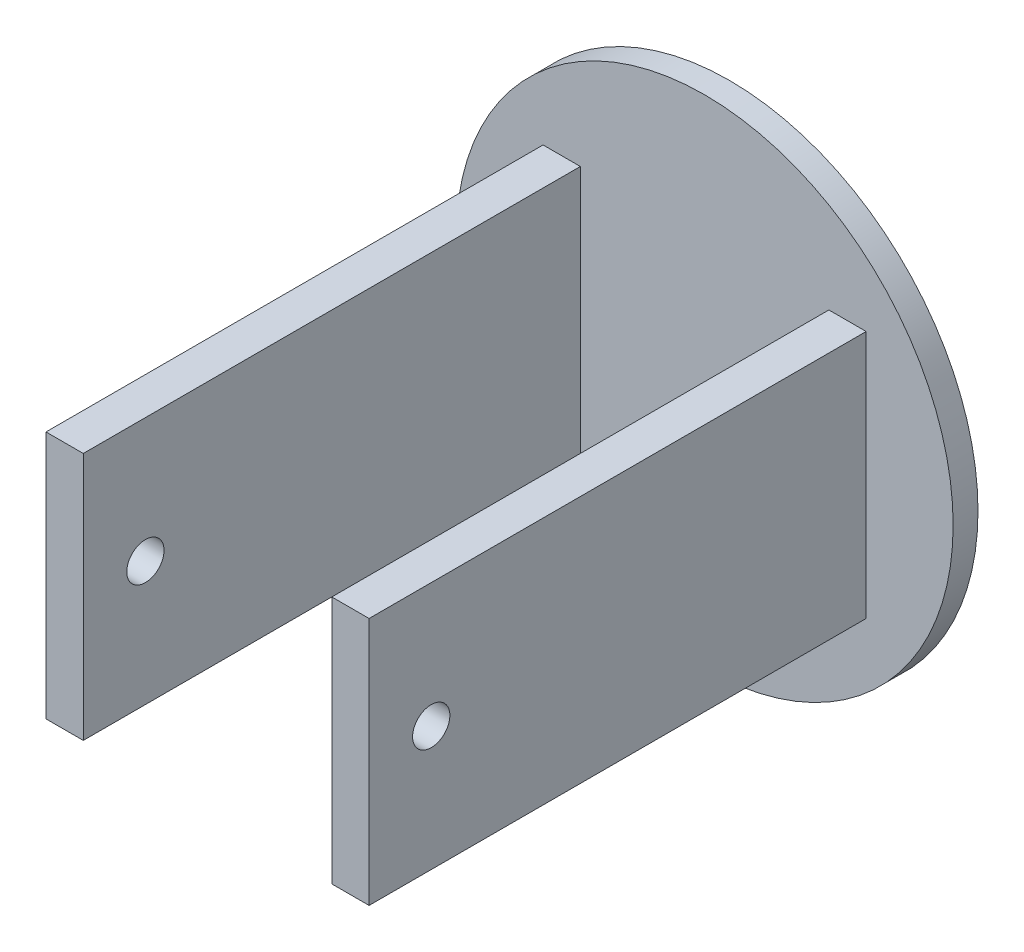
ISO-10303-21;
HEADER;
FILE_DESCRIPTION(('STEP AP214'),'2;1');
FILE_NAME('part.step','',(''),(''),'','','');
FILE_SCHEMA(('AUTOMOTIVE_DESIGN { 1 0 10303 214 1 1 1 1 }'));
ENDSEC;
DATA;
#1=APPLICATION_CONTEXT('core data for automotive mechanical design processes');
#2=APPLICATION_PROTOCOL_DEFINITION('international standard','automotive_design',2000,#1);
#3=PRODUCT_CONTEXT('',#1,'mechanical');
#4=PRODUCT('Part','Part','',(#3));
#5=PRODUCT_RELATED_PRODUCT_CATEGORY('part','',(#4));
#6=PRODUCT_DEFINITION_FORMATION('','',#4);
#7=PRODUCT_DEFINITION_CONTEXT('part definition',#1,'design');
#8=PRODUCT_DEFINITION('design','',#6,#7);
#9=PRODUCT_DEFINITION_SHAPE('','',#8);
#10=(LENGTH_UNIT() NAMED_UNIT(*) SI_UNIT(.MILLI.,.METRE.));
#11=(NAMED_UNIT(*) PLANE_ANGLE_UNIT() SI_UNIT($,.RADIAN.));
#12=(NAMED_UNIT(*) SI_UNIT($,.STERADIAN.) SOLID_ANGLE_UNIT());
#13=UNCERTAINTY_MEASURE_WITH_UNIT(LENGTH_MEASURE(1.E-05),#10,'distance_accuracy_value','');
#14=(GEOMETRIC_REPRESENTATION_CONTEXT(3) GLOBAL_UNCERTAINTY_ASSIGNED_CONTEXT((#13)) GLOBAL_UNIT_ASSIGNED_CONTEXT((#10,
#11,#12)) REPRESENTATION_CONTEXT('',''));
#15=CARTESIAN_POINT('',(0.,0.,0.));
#16=DIRECTION('',(0.,0.,1.));
#17=DIRECTION('',(1.,0.,0.));
#18=AXIS2_PLACEMENT_3D('',#15,#16,#17);
#19=CARTESIAN_POINT('',(0.,0.,2.));
#20=DIRECTION('',(0.,0.,1.));
#21=DIRECTION('',(1.,0.,0.));
#22=AXIS2_PLACEMENT_3D('',#19,#20,#21);
#23=PLANE('',#22);
#24=DIRECTION('',(0.,-1.,0.));
#25=VECTOR('',#24,1.);
#26=CARTESIAN_POINT('',(13.,10.,2.));
#27=LINE('',#26,#25);
#28=CARTESIAN_POINT('',(13.,10.,2.));
#29=VERTEX_POINT('',#28);
#30=CARTESIAN_POINT('',(13.,-10.,2.));
#31=VERTEX_POINT('',#30);
#32=EDGE_CURVE('E104',#29,#31,#27,.T.);
#33=ORIENTED_EDGE('',*,*,#32,.T.);
#34=DIRECTION('',(-1.,0.,0.));
#35=VECTOR('',#34,1.);
#36=CARTESIAN_POINT('',(13.,-10.,2.));
#37=LINE('',#36,#35);
#38=CARTESIAN_POINT('',(10.,-10.,2.));
#39=VERTEX_POINT('',#38);
#40=EDGE_CURVE('E118',#31,#39,#37,.T.);
#41=ORIENTED_EDGE('',*,*,#40,.T.);
#42=DIRECTION('',(0.,1.,0.));
#43=VECTOR('',#42,1.);
#44=CARTESIAN_POINT('',(10.,10.,2.));
#45=LINE('',#44,#43);
#46=CARTESIAN_POINT('',(10.,10.,2.));
#47=VERTEX_POINT('',#46);
#48=EDGE_CURVE('E54',#39,#47,#45,.T.);
#49=ORIENTED_EDGE('',*,*,#48,.T.);
#50=DIRECTION('',(1.,0.,0.));
#51=VECTOR('',#50,1.);
#52=CARTESIAN_POINT('',(13.,10.,2.));
#53=LINE('',#52,#51);
#54=EDGE_CURVE('E49',#47,#29,#53,.T.);
#55=ORIENTED_EDGE('',*,*,#54,.T.);
#56=EDGE_LOOP('',(#33,#41,#49,#55));
#57=FACE_BOUND('',#56,.T.);
#58=CARTESIAN_POINT('',(0.,0.,2.));
#59=DIRECTION('',(0.,0.,1.));
#60=DIRECTION('',(1.,0.,0.));
#61=AXIS2_PLACEMENT_3D('',#58,#59,#60);
#62=CIRCLE('',#61,20.);
#63=CARTESIAN_POINT('',(20.,0.,2.));
#64=VERTEX_POINT('',#63);
#65=EDGE_CURVE('E42',#64,#64,#62,.T.);
#66=ORIENTED_EDGE('',*,*,#65,.T.);
#67=EDGE_LOOP('',(#66));
#68=FACE_BOUND('',#67,.T.);
#69=DIRECTION('',(1.,0.,0.));
#70=VECTOR('',#69,1.);
#71=CARTESIAN_POINT('',(-13.,-10.,2.));
#72=LINE('',#71,#70);
#73=CARTESIAN_POINT('',(-13.,-10.,2.));
#74=VERTEX_POINT('',#73);
#75=CARTESIAN_POINT('',(-10.,-10.,2.));
#76=VERTEX_POINT('',#75);
#77=EDGE_CURVE('E151',#74,#76,#72,.T.);
#78=ORIENTED_EDGE('',*,*,#77,.F.);
#79=DIRECTION('',(0.,-1.,0.));
#80=VECTOR('',#79,1.);
#81=CARTESIAN_POINT('',(-13.,10.,2.));
#82=LINE('',#81,#80);
#83=CARTESIAN_POINT('',(-13.,10.,2.));
#84=VERTEX_POINT('',#83);
#85=EDGE_CURVE('E107',#84,#74,#82,.T.);
#86=ORIENTED_EDGE('',*,*,#85,.F.);
#87=DIRECTION('',(-1.,0.,0.));
#88=VECTOR('',#87,1.);
#89=CARTESIAN_POINT('',(-13.,10.,2.));
#90=LINE('',#89,#88);
#91=CARTESIAN_POINT('',(-10.,10.,2.));
#92=VERTEX_POINT('',#91);
#93=EDGE_CURVE('E142',#92,#84,#90,.T.);
#94=ORIENTED_EDGE('',*,*,#93,.F.);
#95=DIRECTION('',(0.,1.,0.));
#96=VECTOR('',#95,1.);
#97=CARTESIAN_POINT('',(-10.,10.,2.));
#98=LINE('',#97,#96);
#99=EDGE_CURVE('E153',#76,#92,#98,.T.);
#100=ORIENTED_EDGE('',*,*,#99,.F.);
#101=EDGE_LOOP('',(#78,#86,#94,#100));
#102=FACE_BOUND('',#101,.T.);
#103=ADVANCED_FACE('F33',(#57,#68,#102),#23,.T.);
#104=CARTESIAN_POINT('',(0.,0.,2.));
#105=DIRECTION('',(0.,0.,-1.));
#106=DIRECTION('',(-1.,0.,0.));
#107=AXIS2_PLACEMENT_3D('',#104,#105,#106);
#108=CYLINDRICAL_SURFACE('',#107,20.);
#109=ORIENTED_EDGE('',*,*,#65,.F.);
#110=EDGE_LOOP('',(#109));
#111=FACE_BOUND('',#110,.T.);
#112=CARTESIAN_POINT('',(0.,0.,0.));
#113=DIRECTION('',(0.,0.,1.));
#114=DIRECTION('',(1.,0.,0.));
#115=AXIS2_PLACEMENT_3D('',#112,#113,#114);
#116=CIRCLE('',#115,20.);
#117=CARTESIAN_POINT('',(20.,0.,0.));
#118=VERTEX_POINT('',#117);
#119=EDGE_CURVE('E169',#118,#118,#116,.T.);
#120=ORIENTED_EDGE('',*,*,#119,.T.);
#121=EDGE_LOOP('',(#120));
#122=FACE_BOUND('',#121,.T.);
#123=ADVANCED_FACE('F35',(#111,#122),#108,.T.);
#124=CARTESIAN_POINT('',(0.,0.,0.));
#125=DIRECTION('',(0.,0.,1.));
#126=DIRECTION('',(1.,0.,0.));
#127=AXIS2_PLACEMENT_3D('',#124,#125,#126);
#128=PLANE('',#127);
#129=CARTESIAN_POINT('',(0.,0.,0.));
#130=DIRECTION('',(0.,0.,1.));
#131=DIRECTION('',(1.,0.,0.));
#132=AXIS2_PLACEMENT_3D('',#129,#130,#131);
#133=CIRCLE('',#132,2.);
#134=CARTESIAN_POINT('',(2.,0.,0.));
#135=VERTEX_POINT('',#134);
#136=EDGE_CURVE('E11',#135,#135,#133,.F.);
#137=ORIENTED_EDGE('',*,*,#136,.F.);
#138=EDGE_LOOP('',(#137));
#139=FACE_BOUND('',#138,.T.);
#140=ORIENTED_EDGE('',*,*,#119,.F.);
#141=EDGE_LOOP('',(#140));
#142=FACE_BOUND('',#141,.T.);
#143=ADVANCED_FACE('F176',(#139,#142),#128,.F.);
#144=CARTESIAN_POINT('',(0.,0.,-1.));
#145=DIRECTION('',(0.,0.,1.));
#146=DIRECTION('',(1.,0.,0.));
#147=AXIS2_PLACEMENT_3D('',#144,#145,#146);
#148=CYLINDRICAL_SURFACE('',#147,2.);
#149=CARTESIAN_POINT('',(0.,0.,-1.));
#150=DIRECTION('',(0.,0.,-1.));
#151=DIRECTION('',(-1.,0.,0.));
#152=AXIS2_PLACEMENT_3D('',#149,#150,#151);
#153=CIRCLE('',#152,2.);
#154=CARTESIAN_POINT('',(-2.,0.,-1.));
#155=VERTEX_POINT('',#154);
#156=EDGE_CURVE('E166',#155,#155,#153,.T.);
#157=ORIENTED_EDGE('',*,*,#156,.F.);
#158=EDGE_LOOP('',(#157));
#159=FACE_BOUND('',#158,.T.);
#160=ORIENTED_EDGE('',*,*,#136,.T.);
#161=EDGE_LOOP('',(#160));
#162=FACE_BOUND('',#161,.T.);
#163=ADVANCED_FACE('F178',(#159,#162),#148,.T.);
#164=CARTESIAN_POINT('',(0.,0.,-1.));
#165=DIRECTION('',(0.,0.,-1.));
#166=DIRECTION('',(-1.,0.,0.));
#167=AXIS2_PLACEMENT_3D('',#164,#165,#166);
#168=PLANE('',#167);
#169=ORIENTED_EDGE('',*,*,#156,.T.);
#170=EDGE_LOOP('',(#169));
#171=FACE_BOUND('',#170,.T.);
#172=ADVANCED_FACE('F184',(#171),#168,.T.);
#173=CARTESIAN_POINT('',(-13.,10.,42.));
#174=DIRECTION('',(1.,0.,0.));
#175=DIRECTION('',(0.,1.,0.));
#176=AXIS2_PLACEMENT_3D('',#173,#174,#175);
#177=PLANE('',#176);
#178=CARTESIAN_POINT('',(-13.,0.,37.));
#179=DIRECTION('',(-1.,0.,0.));
#180=DIRECTION('',(0.,-1.,0.));
#181=AXIS2_PLACEMENT_3D('',#178,#179,#180);
#182=CIRCLE('',#181,1.5);
#183=CARTESIAN_POINT('',(-13.,-1.50000000000001,37.));
#184=VERTEX_POINT('',#183);
#185=EDGE_CURVE('E247',#184,#184,#182,.T.);
#186=ORIENTED_EDGE('',*,*,#185,.F.);
#187=EDGE_LOOP('',(#186));
#188=FACE_BOUND('',#187,.T.);
#189=ORIENTED_EDGE('',*,*,#85,.T.);
#190=DIRECTION('',(0.,0.,-1.));
#191=VECTOR('',#190,1.);
#192=CARTESIAN_POINT('',(-13.,-10.,42.));
#193=LINE('',#192,#191);
#194=CARTESIAN_POINT('',(-13.,-10.,42.));
#195=VERTEX_POINT('',#194);
#196=EDGE_CURVE('E164',#195,#74,#193,.T.);
#197=ORIENTED_EDGE('',*,*,#196,.F.);
#198=DIRECTION('',(0.,-1.,0.));
#199=VECTOR('',#198,1.);
#200=CARTESIAN_POINT('',(-13.,10.,42.));
#201=LINE('',#200,#199);
#202=CARTESIAN_POINT('',(-13.,10.,42.));
#203=VERTEX_POINT('',#202);
#204=EDGE_CURVE('E138',#203,#195,#201,.T.);
#205=ORIENTED_EDGE('',*,*,#204,.F.);
#206=DIRECTION('',(0.,0.,-1.));
#207=VECTOR('',#206,1.);
#208=CARTESIAN_POINT('',(-13.,10.,42.));
#209=LINE('',#208,#207);
#210=EDGE_CURVE('E148',#203,#84,#209,.T.);
#211=ORIENTED_EDGE('',*,*,#210,.T.);
#212=EDGE_LOOP('',(#189,#197,#205,#211));
#213=FACE_BOUND('',#212,.T.);
#214=ADVANCED_FACE('F197',(#188,#213),#177,.F.);
#215=CARTESIAN_POINT('',(-13.,-10.,42.));
#216=DIRECTION('',(0.,1.,0.));
#217=DIRECTION('',(0.,0.,1.));
#218=AXIS2_PLACEMENT_3D('',#215,#216,#217);
#219=PLANE('',#218);
#220=ORIENTED_EDGE('',*,*,#77,.T.);
#221=DIRECTION('',(0.,0.,-1.));
#222=VECTOR('',#221,1.);
#223=CARTESIAN_POINT('',(-10.,-10.,42.));
#224=LINE('',#223,#222);
#225=CARTESIAN_POINT('',(-10.,-10.,42.));
#226=VERTEX_POINT('',#225);
#227=EDGE_CURVE('E161',#226,#76,#224,.T.);
#228=ORIENTED_EDGE('',*,*,#227,.F.);
#229=DIRECTION('',(1.,0.,0.));
#230=VECTOR('',#229,1.);
#231=CARTESIAN_POINT('',(-13.,-10.,42.));
#232=LINE('',#231,#230);
#233=EDGE_CURVE('E141',#195,#226,#232,.T.);
#234=ORIENTED_EDGE('',*,*,#233,.F.);
#235=ORIENTED_EDGE('',*,*,#196,.T.);
#236=EDGE_LOOP('',(#220,#228,#234,#235));
#237=FACE_BOUND('',#236,.T.);
#238=ADVANCED_FACE('F201',(#237),#219,.F.);
#239=CARTESIAN_POINT('',(-10.,10.,42.));
#240=DIRECTION('',(-1.,0.,0.));
#241=DIRECTION('',(0.,-1.,0.));
#242=AXIS2_PLACEMENT_3D('',#239,#240,#241);
#243=PLANE('',#242);
#244=CARTESIAN_POINT('',(-10.,0.,37.));
#245=DIRECTION('',(-1.,0.,0.));
#246=DIRECTION('',(0.,-1.,0.));
#247=AXIS2_PLACEMENT_3D('',#244,#245,#246);
#248=CIRCLE('',#247,1.5);
#249=CARTESIAN_POINT('',(-10.,-1.50000000000001,37.));
#250=VERTEX_POINT('',#249);
#251=EDGE_CURVE('E129',#250,#250,#248,.T.);
#252=ORIENTED_EDGE('',*,*,#251,.T.);
#253=EDGE_LOOP('',(#252));
#254=FACE_BOUND('',#253,.T.);
#255=ORIENTED_EDGE('',*,*,#99,.T.);
#256=DIRECTION('',(0.,0.,-1.));
#257=VECTOR('',#256,1.);
#258=CARTESIAN_POINT('',(-10.,10.,42.));
#259=LINE('',#258,#257);
#260=CARTESIAN_POINT('',(-10.,10.,42.));
#261=VERTEX_POINT('',#260);
#262=EDGE_CURVE('E159',#261,#92,#259,.T.);
#263=ORIENTED_EDGE('',*,*,#262,.F.);
#264=DIRECTION('',(0.,1.,0.));
#265=VECTOR('',#264,1.);
#266=CARTESIAN_POINT('',(-10.,10.,42.));
#267=LINE('',#266,#265);
#268=EDGE_CURVE('E144',#226,#261,#267,.T.);
#269=ORIENTED_EDGE('',*,*,#268,.F.);
#270=ORIENTED_EDGE('',*,*,#227,.T.);
#271=EDGE_LOOP('',(#255,#263,#269,#270));
#272=FACE_BOUND('',#271,.T.);
#273=ADVANCED_FACE('F205',(#254,#272),#243,.F.);
#274=CARTESIAN_POINT('',(-13.,10.,42.));
#275=DIRECTION('',(0.,-1.,0.));
#276=DIRECTION('',(0.,0.,-1.));
#277=AXIS2_PLACEMENT_3D('',#274,#275,#276);
#278=PLANE('',#277);
#279=ORIENTED_EDGE('',*,*,#93,.T.);
#280=ORIENTED_EDGE('',*,*,#210,.F.);
#281=DIRECTION('',(-1.,0.,0.));
#282=VECTOR('',#281,1.);
#283=CARTESIAN_POINT('',(-13.,10.,42.));
#284=LINE('',#283,#282);
#285=EDGE_CURVE('E146',#261,#203,#284,.T.);
#286=ORIENTED_EDGE('',*,*,#285,.F.);
#287=ORIENTED_EDGE('',*,*,#262,.T.);
#288=EDGE_LOOP('',(#279,#280,#286,#287));
#289=FACE_BOUND('',#288,.T.);
#290=ADVANCED_FACE('F209',(#289),#278,.F.);
#291=CARTESIAN_POINT('',(0.,0.,42.));
#292=DIRECTION('',(0.,0.,1.));
#293=DIRECTION('',(1.,0.,0.));
#294=AXIS2_PLACEMENT_3D('',#291,#292,#293);
#295=PLANE('',#294);
#296=ORIENTED_EDGE('',*,*,#204,.T.);
#297=ORIENTED_EDGE('',*,*,#233,.T.);
#298=ORIENTED_EDGE('',*,*,#268,.T.);
#299=ORIENTED_EDGE('',*,*,#285,.T.);
#300=EDGE_LOOP('',(#296,#297,#298,#299));
#301=FACE_BOUND('',#300,.T.);
#302=ADVANCED_FACE('F213',(#301),#295,.T.);
#303=CARTESIAN_POINT('',(13.,10.,42.));
#304=DIRECTION('',(1.,0.,0.));
#305=DIRECTION('',(0.,1.,0.));
#306=AXIS2_PLACEMENT_3D('',#303,#304,#305);
#307=PLANE('',#306);
#308=CARTESIAN_POINT('',(13.,0.,37.));
#309=DIRECTION('',(1.,0.,0.));
#310=DIRECTION('',(0.,1.,0.));
#311=AXIS2_PLACEMENT_3D('',#308,#309,#310);
#312=CIRCLE('',#311,1.5);
#313=CARTESIAN_POINT('',(13.,1.50000000000001,37.));
#314=VERTEX_POINT('',#313);
#315=EDGE_CURVE('E244',#314,#314,#312,.T.);
#316=ORIENTED_EDGE('',*,*,#315,.F.);
#317=EDGE_LOOP('',(#316));
#318=FACE_BOUND('',#317,.T.);
#319=ORIENTED_EDGE('',*,*,#32,.F.);
#320=DIRECTION('',(0.,0.,-1.));
#321=VECTOR('',#320,1.);
#322=CARTESIAN_POINT('',(13.,10.,42.));
#323=LINE('',#322,#321);
#324=CARTESIAN_POINT('',(13.,10.,42.));
#325=VERTEX_POINT('',#324);
#326=EDGE_CURVE('E98',#325,#29,#323,.T.);
#327=ORIENTED_EDGE('',*,*,#326,.F.);
#328=DIRECTION('',(0.,-1.,0.));
#329=VECTOR('',#328,1.);
#330=CARTESIAN_POINT('',(13.,10.,42.));
#331=LINE('',#330,#329);
#332=CARTESIAN_POINT('',(13.,-10.,42.));
#333=VERTEX_POINT('',#332);
#334=EDGE_CURVE('E102',#325,#333,#331,.T.);
#335=ORIENTED_EDGE('',*,*,#334,.T.);
#336=DIRECTION('',(0.,0.,-1.));
#337=VECTOR('',#336,1.);
#338=CARTESIAN_POINT('',(13.,-10.,42.));
#339=LINE('',#338,#337);
#340=EDGE_CURVE('E127',#333,#31,#339,.T.);
#341=ORIENTED_EDGE('',*,*,#340,.T.);
#342=EDGE_LOOP('',(#319,#327,#335,#341));
#343=FACE_BOUND('',#342,.T.);
#344=ADVANCED_FACE('F100',(#318,#343),#307,.T.);
#345=CARTESIAN_POINT('',(13.,10.,42.));
#346=DIRECTION('',(0.,1.,0.));
#347=DIRECTION('',(0.,0.,1.));
#348=AXIS2_PLACEMENT_3D('',#345,#346,#347);
#349=PLANE('',#348);
#350=ORIENTED_EDGE('',*,*,#54,.F.);
#351=DIRECTION('',(0.,0.,-1.));
#352=VECTOR('',#351,1.);
#353=CARTESIAN_POINT('',(10.,10.,42.));
#354=LINE('',#353,#352);
#355=CARTESIAN_POINT('',(10.,10.,42.));
#356=VERTEX_POINT('',#355);
#357=EDGE_CURVE('E108',#356,#47,#354,.T.);
#358=ORIENTED_EDGE('',*,*,#357,.F.);
#359=DIRECTION('',(1.,0.,0.));
#360=VECTOR('',#359,1.);
#361=CARTESIAN_POINT('',(13.,10.,42.));
#362=LINE('',#361,#360);
#363=EDGE_CURVE('E114',#356,#325,#362,.T.);
#364=ORIENTED_EDGE('',*,*,#363,.T.);
#365=ORIENTED_EDGE('',*,*,#326,.T.);
#366=EDGE_LOOP('',(#350,#358,#364,#365));
#367=FACE_BOUND('',#366,.T.);
#368=ADVANCED_FACE('F120',(#367),#349,.T.);
#369=CARTESIAN_POINT('',(10.,10.,42.));
#370=DIRECTION('',(-1.,0.,0.));
#371=DIRECTION('',(0.,-1.,0.));
#372=AXIS2_PLACEMENT_3D('',#369,#370,#371);
#373=PLANE('',#372);
#374=CARTESIAN_POINT('',(10.,0.,37.));
#375=DIRECTION('',(-1.,0.,0.));
#376=DIRECTION('',(0.,-1.,0.));
#377=AXIS2_PLACEMENT_3D('',#374,#375,#376);
#378=CIRCLE('',#377,1.5);
#379=CARTESIAN_POINT('',(10.,-1.5,37.));
#380=VERTEX_POINT('',#379);
#381=EDGE_CURVE('E37',#380,#380,#378,.T.);
#382=ORIENTED_EDGE('',*,*,#381,.F.);
#383=EDGE_LOOP('',(#382));
#384=FACE_BOUND('',#383,.T.);
#385=ORIENTED_EDGE('',*,*,#48,.F.);
#386=DIRECTION('',(0.,0.,-1.));
#387=VECTOR('',#386,1.);
#388=CARTESIAN_POINT('',(10.,-10.,42.));
#389=LINE('',#388,#387);
#390=CARTESIAN_POINT('',(10.,-10.,42.));
#391=VERTEX_POINT('',#390);
#392=EDGE_CURVE('E134',#391,#39,#389,.T.);
#393=ORIENTED_EDGE('',*,*,#392,.F.);
#394=DIRECTION('',(0.,1.,0.));
#395=VECTOR('',#394,1.);
#396=CARTESIAN_POINT('',(10.,10.,42.));
#397=LINE('',#396,#395);
#398=EDGE_CURVE('E121',#391,#356,#397,.T.);
#399=ORIENTED_EDGE('',*,*,#398,.T.);
#400=ORIENTED_EDGE('',*,*,#357,.T.);
#401=EDGE_LOOP('',(#385,#393,#399,#400));
#402=FACE_BOUND('',#401,.T.);
#403=ADVANCED_FACE('F223',(#384,#402),#373,.T.);
#404=CARTESIAN_POINT('',(13.,-10.,42.));
#405=DIRECTION('',(0.,-1.,0.));
#406=DIRECTION('',(0.,0.,-1.));
#407=AXIS2_PLACEMENT_3D('',#404,#405,#406);
#408=PLANE('',#407);
#409=ORIENTED_EDGE('',*,*,#40,.F.);
#410=ORIENTED_EDGE('',*,*,#340,.F.);
#411=DIRECTION('',(-1.,0.,0.));
#412=VECTOR('',#411,1.);
#413=CARTESIAN_POINT('',(13.,-10.,42.));
#414=LINE('',#413,#412);
#415=EDGE_CURVE('E117',#333,#391,#414,.T.);
#416=ORIENTED_EDGE('',*,*,#415,.T.);
#417=ORIENTED_EDGE('',*,*,#392,.T.);
#418=EDGE_LOOP('',(#409,#410,#416,#417));
#419=FACE_BOUND('',#418,.T.);
#420=ADVANCED_FACE('F226',(#419),#408,.T.);
#421=CARTESIAN_POINT('',(0.,0.,42.));
#422=DIRECTION('',(0.,0.,1.));
#423=DIRECTION('',(-1.,0.,0.));
#424=AXIS2_PLACEMENT_3D('',#421,#422,#423);
#425=PLANE('',#424);
#426=ORIENTED_EDGE('',*,*,#334,.F.);
#427=ORIENTED_EDGE('',*,*,#363,.F.);
#428=ORIENTED_EDGE('',*,*,#398,.F.);
#429=ORIENTED_EDGE('',*,*,#415,.F.);
#430=EDGE_LOOP('',(#426,#427,#428,#429));
#431=FACE_BOUND('',#430,.T.);
#432=ADVANCED_FACE('F112',(#431),#425,.T.);
#433=CARTESIAN_POINT('',(20.,0.,37.));
#434=DIRECTION('',(-1.,0.,0.));
#435=DIRECTION('',(0.,-1.,0.));
#436=AXIS2_PLACEMENT_3D('',#433,#434,#435);
#437=CYLINDRICAL_SURFACE('',#436,1.5);
#438=ORIENTED_EDGE('',*,*,#315,.T.);
#439=EDGE_LOOP('',(#438));
#440=FACE_BOUND('',#439,.T.);
#441=ORIENTED_EDGE('',*,*,#381,.T.);
#442=EDGE_LOOP('',(#441));
#443=FACE_BOUND('',#442,.T.);
#444=ADVANCED_FACE('F233',(#440,#443),#437,.F.);
#445=ORIENTED_EDGE('',*,*,#185,.T.);
#446=EDGE_LOOP('',(#445));
#447=FACE_BOUND('',#446,.T.);
#448=ORIENTED_EDGE('',*,*,#251,.F.);
#449=EDGE_LOOP('',(#448));
#450=FACE_BOUND('',#449,.T.);
#451=ADVANCED_FACE('F235',(#447,#450),#437,.F.);
#452=CLOSED_SHELL('',(#103,#123,#143,#163,#172,#214,#238,#273,#290,#302,#344,#368,#403,#420,
#432,#444,#451));
#453=MANIFOLD_SOLID_BREP('B2',#452);
#454=ADVANCED_BREP_SHAPE_REPRESENTATION('',(#18,#453),#14);
#455=SHAPE_DEFINITION_REPRESENTATION(#9,#454);
ENDSEC;
END-ISO-10303-21;
